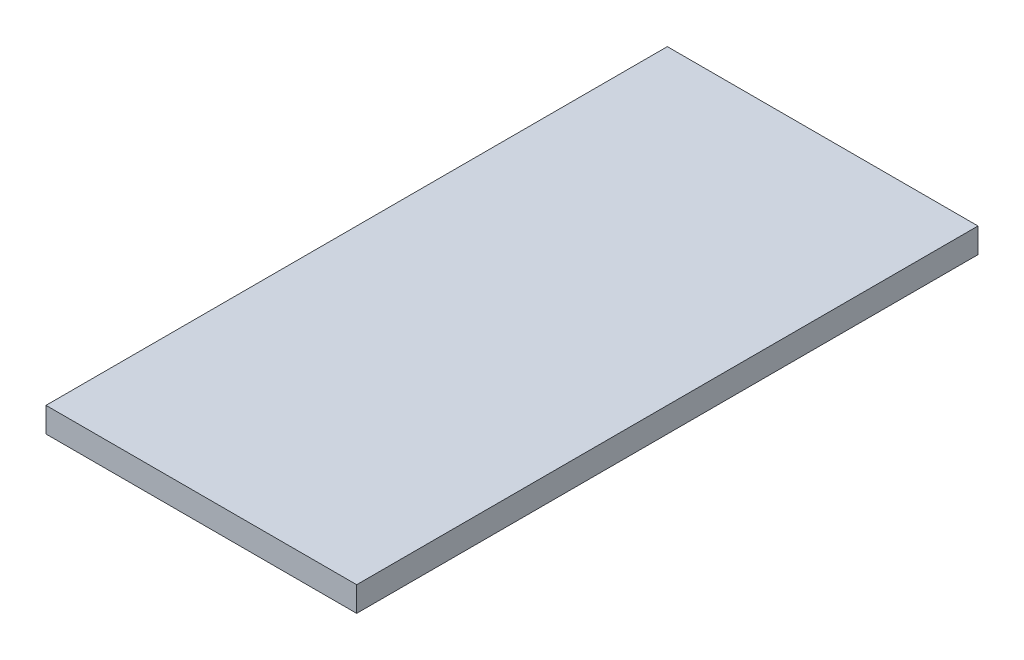
ISO-10303-21;
HEADER;
FILE_DESCRIPTION(('STEP AP214'),'2;1');
FILE_NAME('part.step','',(''),(''),'','','');
FILE_SCHEMA(('AUTOMOTIVE_DESIGN { 1 0 10303 214 1 1 1 1 }'));
ENDSEC;
DATA;
#1=APPLICATION_CONTEXT('core data for automotive mechanical design processes');
#2=APPLICATION_PROTOCOL_DEFINITION('international standard','automotive_design',2000,#1);
#3=PRODUCT_CONTEXT('',#1,'mechanical');
#4=PRODUCT('Part','Part','',(#3));
#5=PRODUCT_RELATED_PRODUCT_CATEGORY('part','',(#4));
#6=PRODUCT_DEFINITION_FORMATION('','',#4);
#7=PRODUCT_DEFINITION_CONTEXT('part definition',#1,'design');
#8=PRODUCT_DEFINITION('design','',#6,#7);
#9=PRODUCT_DEFINITION_SHAPE('','',#8);
#10=(LENGTH_UNIT() NAMED_UNIT(*) SI_UNIT(.MILLI.,.METRE.));
#11=(NAMED_UNIT(*) PLANE_ANGLE_UNIT() SI_UNIT($,.RADIAN.));
#12=(NAMED_UNIT(*) SI_UNIT($,.STERADIAN.) SOLID_ANGLE_UNIT());
#13=UNCERTAINTY_MEASURE_WITH_UNIT(LENGTH_MEASURE(1.E-05),#10,'distance_accuracy_value','');
#14=(GEOMETRIC_REPRESENTATION_CONTEXT(3) GLOBAL_UNCERTAINTY_ASSIGNED_CONTEXT((#13)) GLOBAL_UNIT_ASSIGNED_CONTEXT((#10,
#11,#12)) REPRESENTATION_CONTEXT('',''));
#15=CARTESIAN_POINT('',(0.,0.,0.));
#16=DIRECTION('',(0.,0.,1.));
#17=DIRECTION('',(1.,0.,0.));
#18=AXIS2_PLACEMENT_3D('',#15,#16,#17);
#19=CARTESIAN_POINT('',(-100.,16.,200.));
#20=DIRECTION('',(0.,0.,-1.));
#21=DIRECTION('',(-1.,0.,0.));
#22=AXIS2_PLACEMENT_3D('',#19,#20,#21);
#23=PLANE('',#22);
#24=DIRECTION('',(1.,0.,0.));
#25=VECTOR('',#24,1.);
#26=CARTESIAN_POINT('',(-100.,0.,200.));
#27=LINE('',#26,#25);
#28=CARTESIAN_POINT('',(-100.,0.,200.));
#29=VERTEX_POINT('',#28);
#30=CARTESIAN_POINT('',(100.,0.,200.));
#31=VERTEX_POINT('',#30);
#32=EDGE_CURVE('E102',#29,#31,#27,.T.);
#33=ORIENTED_EDGE('',*,*,#32,.T.);
#34=DIRECTION('',(0.,-1.,0.));
#35=VECTOR('',#34,1.);
#36=CARTESIAN_POINT('',(100.,16.,200.));
#37=LINE('',#36,#35);
#38=CARTESIAN_POINT('',(100.,16.,200.));
#39=VERTEX_POINT('',#38);
#40=EDGE_CURVE('E11',#39,#31,#37,.T.);
#41=ORIENTED_EDGE('',*,*,#40,.F.);
#42=DIRECTION('',(1.,0.,0.));
#43=VECTOR('',#42,1.);
#44=CARTESIAN_POINT('',(-100.,16.,200.));
#45=LINE('',#44,#43);
#46=CARTESIAN_POINT('',(-100.,16.,200.));
#47=VERTEX_POINT('',#46);
#48=EDGE_CURVE('E88',#47,#39,#45,.T.);
#49=ORIENTED_EDGE('',*,*,#48,.F.);
#50=DIRECTION('',(0.,-1.,0.));
#51=VECTOR('',#50,1.);
#52=CARTESIAN_POINT('',(-100.,16.,200.));
#53=LINE('',#52,#51);
#54=EDGE_CURVE('E55',#47,#29,#53,.T.);
#55=ORIENTED_EDGE('',*,*,#54,.T.);
#56=EDGE_LOOP('',(#33,#41,#49,#55));
#57=FACE_BOUND('',#56,.T.);
#58=ADVANCED_FACE('F39',(#57),#23,.F.);
#59=CARTESIAN_POINT('',(100.,16.,200.));
#60=DIRECTION('',(-1.,0.,0.));
#61=DIRECTION('',(0.,0.,1.));
#62=AXIS2_PLACEMENT_3D('',#59,#60,#61);
#63=PLANE('',#62);
#64=DIRECTION('',(0.,0.,-1.));
#65=VECTOR('',#64,1.);
#66=CARTESIAN_POINT('',(100.,0.,200.));
#67=LINE('',#66,#65);
#68=CARTESIAN_POINT('',(100.,0.,-200.));
#69=VERTEX_POINT('',#68);
#70=EDGE_CURVE('E93',#31,#69,#67,.T.);
#71=ORIENTED_EDGE('',*,*,#70,.T.);
#72=DIRECTION('',(0.,-1.,0.));
#73=VECTOR('',#72,1.);
#74=CARTESIAN_POINT('',(100.,16.,-200.));
#75=LINE('',#74,#73);
#76=CARTESIAN_POINT('',(100.,16.,-200.));
#77=VERTEX_POINT('',#76);
#78=EDGE_CURVE('E47',#77,#69,#75,.T.);
#79=ORIENTED_EDGE('',*,*,#78,.F.);
#80=DIRECTION('',(0.,0.,-1.));
#81=VECTOR('',#80,1.);
#82=CARTESIAN_POINT('',(100.,16.,200.));
#83=LINE('',#82,#81);
#84=EDGE_CURVE('E80',#39,#77,#83,.T.);
#85=ORIENTED_EDGE('',*,*,#84,.F.);
#86=ORIENTED_EDGE('',*,*,#40,.T.);
#87=EDGE_LOOP('',(#71,#79,#85,#86));
#88=FACE_BOUND('',#87,.T.);
#89=ADVANCED_FACE('F92',(#88),#63,.F.);
#90=CARTESIAN_POINT('',(-100.,16.,-200.));
#91=DIRECTION('',(0.,0.,-1.));
#92=DIRECTION('',(-1.,0.,0.));
#93=AXIS2_PLACEMENT_3D('',#90,#91,#92);
#94=PLANE('',#93);
#95=DIRECTION('',(1.,0.,0.));
#96=VECTOR('',#95,1.);
#97=CARTESIAN_POINT('',(-100.,0.,-200.));
#98=LINE('',#97,#96);
#99=CARTESIAN_POINT('',(-100.,0.,-200.));
#100=VERTEX_POINT('',#99);
#101=EDGE_CURVE('E105',#100,#69,#98,.T.);
#102=ORIENTED_EDGE('',*,*,#101,.F.);
#103=DIRECTION('',(0.,-1.,0.));
#104=VECTOR('',#103,1.);
#105=CARTESIAN_POINT('',(-100.,16.,-200.));
#106=LINE('',#105,#104);
#107=CARTESIAN_POINT('',(-100.,16.,-200.));
#108=VERTEX_POINT('',#107);
#109=EDGE_CURVE('E69',#108,#100,#106,.T.);
#110=ORIENTED_EDGE('',*,*,#109,.F.);
#111=DIRECTION('',(1.,0.,0.));
#112=VECTOR('',#111,1.);
#113=CARTESIAN_POINT('',(-100.,16.,-200.));
#114=LINE('',#113,#112);
#115=EDGE_CURVE('E87',#108,#77,#114,.T.);
#116=ORIENTED_EDGE('',*,*,#115,.T.);
#117=ORIENTED_EDGE('',*,*,#78,.T.);
#118=EDGE_LOOP('',(#102,#110,#116,#117));
#119=FACE_BOUND('',#118,.T.);
#120=ADVANCED_FACE('F96',(#119),#94,.T.);
#121=CARTESIAN_POINT('',(-100.,16.,200.));
#122=DIRECTION('',(-1.,0.,0.));
#123=DIRECTION('',(0.,0.,1.));
#124=AXIS2_PLACEMENT_3D('',#121,#122,#123);
#125=PLANE('',#124);
#126=DIRECTION('',(0.,0.,-1.));
#127=VECTOR('',#126,1.);
#128=CARTESIAN_POINT('',(-100.,0.,200.));
#129=LINE('',#128,#127);
#130=EDGE_CURVE('E107',#29,#100,#129,.T.);
#131=ORIENTED_EDGE('',*,*,#130,.F.);
#132=ORIENTED_EDGE('',*,*,#54,.F.);
#133=DIRECTION('',(0.,0.,-1.));
#134=VECTOR('',#133,1.);
#135=CARTESIAN_POINT('',(-100.,16.,200.));
#136=LINE('',#135,#134);
#137=EDGE_CURVE('E97',#47,#108,#136,.T.);
#138=ORIENTED_EDGE('',*,*,#137,.T.);
#139=ORIENTED_EDGE('',*,*,#109,.T.);
#140=EDGE_LOOP('',(#131,#132,#138,#139));
#141=FACE_BOUND('',#140,.T.);
#142=ADVANCED_FACE('F113',(#141),#125,.T.);
#143=CARTESIAN_POINT('',(0.,16.,0.));
#144=DIRECTION('',(0.,1.,0.));
#145=DIRECTION('',(0.,0.,1.));
#146=AXIS2_PLACEMENT_3D('',#143,#144,#145);
#147=PLANE('',#146);
#148=ORIENTED_EDGE('',*,*,#48,.T.);
#149=ORIENTED_EDGE('',*,*,#84,.T.);
#150=ORIENTED_EDGE('',*,*,#115,.F.);
#151=ORIENTED_EDGE('',*,*,#137,.F.);
#152=EDGE_LOOP('',(#148,#149,#150,#151));
#153=FACE_BOUND('',#152,.T.);
#154=ADVANCED_FACE('F84',(#153),#147,.T.);
#155=CARTESIAN_POINT('',(0.,0.,0.));
#156=DIRECTION('',(0.,1.,0.));
#157=DIRECTION('',(0.,0.,1.));
#158=AXIS2_PLACEMENT_3D('',#155,#156,#157);
#159=PLANE('',#158);
#160=ORIENTED_EDGE('',*,*,#32,.F.);
#161=ORIENTED_EDGE('',*,*,#130,.T.);
#162=ORIENTED_EDGE('',*,*,#101,.T.);
#163=ORIENTED_EDGE('',*,*,#70,.F.);
#164=EDGE_LOOP('',(#160,#161,#162,#163));
#165=FACE_BOUND('',#164,.T.);
#166=ADVANCED_FACE('F112',(#165),#159,.F.);
#167=CLOSED_SHELL('',(#58,#89,#120,#142,#154,#166));
#168=MANIFOLD_SOLID_BREP('B2',#167);
#169=ADVANCED_BREP_SHAPE_REPRESENTATION('',(#18,#168),#14);
#170=SHAPE_DEFINITION_REPRESENTATION(#9,#169);
ENDSEC;
END-ISO-10303-21;
